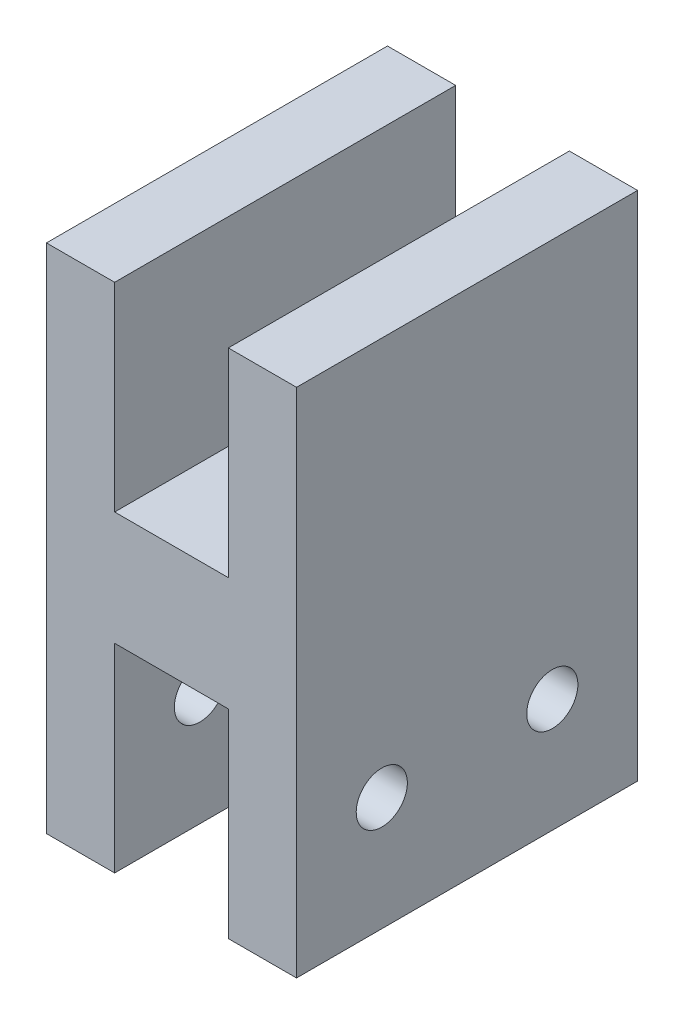
ISO-10303-21;
HEADER;
FILE_DESCRIPTION(('STEP AP214'),'2;1');
FILE_NAME('part.step','',(''),(''),'','','');
FILE_SCHEMA(('AUTOMOTIVE_DESIGN { 1 0 10303 214 1 1 1 1 }'));
ENDSEC;
DATA;
#1=APPLICATION_CONTEXT('core data for automotive mechanical design processes');
#2=APPLICATION_PROTOCOL_DEFINITION('international standard','automotive_design',2000,#1);
#3=PRODUCT_CONTEXT('',#1,'mechanical');
#4=PRODUCT('Part','Part','',(#3));
#5=PRODUCT_RELATED_PRODUCT_CATEGORY('part','',(#4));
#6=PRODUCT_DEFINITION_FORMATION('','',#4);
#7=PRODUCT_DEFINITION_CONTEXT('part definition',#1,'design');
#8=PRODUCT_DEFINITION('design','',#6,#7);
#9=PRODUCT_DEFINITION_SHAPE('','',#8);
#10=(LENGTH_UNIT() NAMED_UNIT(*) SI_UNIT(.MILLI.,.METRE.));
#11=(NAMED_UNIT(*) PLANE_ANGLE_UNIT() SI_UNIT($,.RADIAN.));
#12=(NAMED_UNIT(*) SI_UNIT($,.STERADIAN.) SOLID_ANGLE_UNIT());
#13=UNCERTAINTY_MEASURE_WITH_UNIT(LENGTH_MEASURE(1.E-05),#10,'distance_accuracy_value','');
#14=(GEOMETRIC_REPRESENTATION_CONTEXT(3) GLOBAL_UNCERTAINTY_ASSIGNED_CONTEXT((#13)) GLOBAL_UNIT_ASSIGNED_CONTEXT((#10,
#11,#12)) REPRESENTATION_CONTEXT('',''));
#15=CARTESIAN_POINT('',(0.,0.,0.));
#16=DIRECTION('',(0.,0.,1.));
#17=DIRECTION('',(1.,0.,0.));
#18=AXIS2_PLACEMENT_3D('',#15,#16,#17);
#19=CARTESIAN_POINT('',(-5.,17.5,30.));
#20=DIRECTION('',(0.,-1.,0.));
#21=DIRECTION('',(0.,0.,-1.));
#22=AXIS2_PLACEMENT_3D('',#19,#20,#21);
#23=PLANE('',#22);
#24=DIRECTION('',(-1.,0.,0.));
#25=VECTOR('',#24,1.);
#26=CARTESIAN_POINT('',(-5.,17.5,0.));
#27=LINE('',#26,#25);
#28=CARTESIAN_POINT('',(-5.,17.5,0.));
#29=VERTEX_POINT('',#28);
#30=CARTESIAN_POINT('',(-11.,17.5,0.));
#31=VERTEX_POINT('',#30);
#32=EDGE_CURVE('E159',#29,#31,#27,.T.);
#33=ORIENTED_EDGE('',*,*,#32,.T.);
#34=DIRECTION('',(0.,0.,-1.));
#35=VECTOR('',#34,1.);
#36=CARTESIAN_POINT('',(-11.,17.5,30.));
#37=LINE('',#36,#35);
#38=CARTESIAN_POINT('',(-11.,17.5,30.));
#39=VERTEX_POINT('',#38);
#40=EDGE_CURVE('E11',#39,#31,#37,.T.);
#41=ORIENTED_EDGE('',*,*,#40,.F.);
#42=DIRECTION('',(-1.,0.,0.));
#43=VECTOR('',#42,1.);
#44=CARTESIAN_POINT('',(-5.,17.5,30.));
#45=LINE('',#44,#43);
#46=CARTESIAN_POINT('',(-5.,17.5,30.));
#47=VERTEX_POINT('',#46);
#48=EDGE_CURVE('E182',#47,#39,#45,.T.);
#49=ORIENTED_EDGE('',*,*,#48,.F.);
#50=DIRECTION('',(0.,0.,-1.));
#51=VECTOR('',#50,1.);
#52=CARTESIAN_POINT('',(-5.,17.5,30.));
#53=LINE('',#52,#51);
#54=EDGE_CURVE('E155',#47,#29,#53,.T.);
#55=ORIENTED_EDGE('',*,*,#54,.T.);
#56=EDGE_LOOP('',(#33,#41,#49,#55));
#57=FACE_BOUND('',#56,.T.);
#58=ADVANCED_FACE('F37',(#57),#23,.F.);
#59=CARTESIAN_POINT('',(-11.,-27.5,30.));
#60=DIRECTION('',(1.,0.,0.));
#61=DIRECTION('',(0.,1.,0.));
#62=AXIS2_PLACEMENT_3D('',#59,#60,#61);
#63=PLANE('',#62);
#64=CARTESIAN_POINT('',(-11.,-17.5,7.5));
#65=DIRECTION('',(-1.,0.,0.));
#66=DIRECTION('',(0.,0.,1.));
#67=AXIS2_PLACEMENT_3D('',#64,#65,#66);
#68=CIRCLE('',#67,2.25);
#69=CARTESIAN_POINT('',(-11.,-17.5,9.75));
#70=VERTEX_POINT('',#69);
#71=EDGE_CURVE('E456',#70,#70,#68,.T.);
#72=ORIENTED_EDGE('',*,*,#71,.F.);
#73=EDGE_LOOP('',(#72));
#74=FACE_BOUND('',#73,.T.);
#75=CARTESIAN_POINT('',(-11.,-17.5,22.5));
#76=DIRECTION('',(-1.,0.,0.));
#77=DIRECTION('',(0.,0.,1.));
#78=AXIS2_PLACEMENT_3D('',#75,#76,#77);
#79=CIRCLE('',#78,2.25);
#80=CARTESIAN_POINT('',(-11.,-17.5,24.75));
#81=VERTEX_POINT('',#80);
#82=EDGE_CURVE('E208',#81,#81,#79,.T.);
#83=ORIENTED_EDGE('',*,*,#82,.F.);
#84=EDGE_LOOP('',(#83));
#85=FACE_BOUND('',#84,.T.);
#86=DIRECTION('',(0.,-1.,0.));
#87=VECTOR('',#86,1.);
#88=CARTESIAN_POINT('',(-11.,-27.5,0.));
#89=LINE('',#88,#87);
#90=CARTESIAN_POINT('',(-11.,-27.5,0.));
#91=VERTEX_POINT('',#90);
#92=EDGE_CURVE('E162',#31,#91,#89,.T.);
#93=ORIENTED_EDGE('',*,*,#92,.T.);
#94=DIRECTION('',(0.,0.,-1.));
#95=VECTOR('',#94,1.);
#96=CARTESIAN_POINT('',(-11.,-27.5,30.));
#97=LINE('',#96,#95);
#98=CARTESIAN_POINT('',(-11.,-27.5,30.));
#99=VERTEX_POINT('',#98);
#100=EDGE_CURVE('E46',#99,#91,#97,.T.);
#101=ORIENTED_EDGE('',*,*,#100,.F.);
#102=DIRECTION('',(0.,-1.,0.));
#103=VECTOR('',#102,1.);
#104=CARTESIAN_POINT('',(-11.,-27.5,30.));
#105=LINE('',#104,#103);
#106=EDGE_CURVE('E110',#39,#99,#105,.T.);
#107=ORIENTED_EDGE('',*,*,#106,.F.);
#108=ORIENTED_EDGE('',*,*,#40,.T.);
#109=EDGE_LOOP('',(#93,#101,#107,#108));
#110=FACE_BOUND('',#109,.T.);
#111=ADVANCED_FACE('F266',(#74,#85,#110),#63,.F.);
#112=CARTESIAN_POINT('',(-5.,-27.5,30.));
#113=DIRECTION('',(0.,1.,0.));
#114=DIRECTION('',(-1.,0.,0.));
#115=AXIS2_PLACEMENT_3D('',#112,#113,#114);
#116=PLANE('',#115);
#117=DIRECTION('',(1.,0.,0.));
#118=VECTOR('',#117,1.);
#119=CARTESIAN_POINT('',(-5.,-27.5,0.));
#120=LINE('',#119,#118);
#121=CARTESIAN_POINT('',(-5.,-27.5,0.));
#122=VERTEX_POINT('',#121);
#123=EDGE_CURVE('E165',#91,#122,#120,.T.);
#124=ORIENTED_EDGE('',*,*,#123,.T.);
#125=DIRECTION('',(0.,0.,-1.));
#126=VECTOR('',#125,1.);
#127=CARTESIAN_POINT('',(-5.,-27.5,30.));
#128=LINE('',#127,#126);
#129=CARTESIAN_POINT('',(-5.,-27.5,30.));
#130=VERTEX_POINT('',#129);
#131=EDGE_CURVE('E201',#130,#122,#128,.T.);
#132=ORIENTED_EDGE('',*,*,#131,.F.);
#133=DIRECTION('',(1.,0.,0.));
#134=VECTOR('',#133,1.);
#135=CARTESIAN_POINT('',(-5.,-27.5,30.));
#136=LINE('',#135,#134);
#137=EDGE_CURVE('E227',#99,#130,#136,.T.);
#138=ORIENTED_EDGE('',*,*,#137,.F.);
#139=ORIENTED_EDGE('',*,*,#100,.T.);
#140=EDGE_LOOP('',(#124,#132,#138,#139));
#141=FACE_BOUND('',#140,.T.);
#142=ADVANCED_FACE('F270',(#141),#116,.F.);
#143=CARTESIAN_POINT('',(-5.,-10.,30.));
#144=DIRECTION('',(-1.,0.,0.));
#145=DIRECTION('',(0.,0.,1.));
#146=AXIS2_PLACEMENT_3D('',#143,#144,#145);
#147=PLANE('',#146);
#148=CARTESIAN_POINT('',(-5.,-17.5,7.5));
#149=DIRECTION('',(-1.,0.,0.));
#150=DIRECTION('',(0.,0.,1.));
#151=AXIS2_PLACEMENT_3D('',#148,#149,#150);
#152=CIRCLE('',#151,2.25);
#153=CARTESIAN_POINT('',(-5.,-17.5,9.75));
#154=VERTEX_POINT('',#153);
#155=EDGE_CURVE('E214',#154,#154,#152,.T.);
#156=ORIENTED_EDGE('',*,*,#155,.T.);
#157=EDGE_LOOP('',(#156));
#158=FACE_BOUND('',#157,.T.);
#159=CARTESIAN_POINT('',(-5.,-17.5,22.5));
#160=DIRECTION('',(-1.,0.,0.));
#161=DIRECTION('',(0.,0.,1.));
#162=AXIS2_PLACEMENT_3D('',#159,#160,#161);
#163=CIRCLE('',#162,2.25);
#164=CARTESIAN_POINT('',(-5.,-17.5,24.75));
#165=VERTEX_POINT('',#164);
#166=EDGE_CURVE('E163',#165,#165,#163,.T.);
#167=ORIENTED_EDGE('',*,*,#166,.T.);
#168=EDGE_LOOP('',(#167));
#169=FACE_BOUND('',#168,.T.);
#170=DIRECTION('',(0.,1.,0.));
#171=VECTOR('',#170,1.);
#172=CARTESIAN_POINT('',(-5.,-10.,0.));
#173=LINE('',#172,#171);
#174=CARTESIAN_POINT('',(-5.,-10.,0.));
#175=VERTEX_POINT('',#174);
#176=EDGE_CURVE('E167',#122,#175,#173,.T.);
#177=ORIENTED_EDGE('',*,*,#176,.T.);
#178=DIRECTION('',(0.,0.,-1.));
#179=VECTOR('',#178,1.);
#180=CARTESIAN_POINT('',(-5.,-10.,30.));
#181=LINE('',#180,#179);
#182=CARTESIAN_POINT('',(-5.,-10.,30.));
#183=VERTEX_POINT('',#182);
#184=EDGE_CURVE('E198',#183,#175,#181,.T.);
#185=ORIENTED_EDGE('',*,*,#184,.F.);
#186=DIRECTION('',(0.,1.,0.));
#187=VECTOR('',#186,1.);
#188=CARTESIAN_POINT('',(-5.,-10.,30.));
#189=LINE('',#188,#187);
#190=EDGE_CURVE('E229',#130,#183,#189,.T.);
#191=ORIENTED_EDGE('',*,*,#190,.F.);
#192=ORIENTED_EDGE('',*,*,#131,.T.);
#193=EDGE_LOOP('',(#177,#185,#191,#192));
#194=FACE_BOUND('',#193,.T.);
#195=ADVANCED_FACE('F275',(#158,#169,#194),#147,.F.);
#196=CARTESIAN_POINT('',(5.,-10.,30.));
#197=DIRECTION('',(0.,1.,0.));
#198=DIRECTION('',(0.,0.,1.));
#199=AXIS2_PLACEMENT_3D('',#196,#197,#198);
#200=PLANE('',#199);
#201=DIRECTION('',(1.,0.,0.));
#202=VECTOR('',#201,1.);
#203=CARTESIAN_POINT('',(5.,-10.,0.));
#204=LINE('',#203,#202);
#205=CARTESIAN_POINT('',(5.,-10.,0.));
#206=VERTEX_POINT('',#205);
#207=EDGE_CURVE('E169',#175,#206,#204,.T.);
#208=ORIENTED_EDGE('',*,*,#207,.T.);
#209=DIRECTION('',(0.,0.,-1.));
#210=VECTOR('',#209,1.);
#211=CARTESIAN_POINT('',(5.,-10.,30.));
#212=LINE('',#211,#210);
#213=CARTESIAN_POINT('',(5.,-10.,30.));
#214=VERTEX_POINT('',#213);
#215=EDGE_CURVE('E195',#214,#206,#212,.T.);
#216=ORIENTED_EDGE('',*,*,#215,.F.);
#217=DIRECTION('',(1.,0.,0.));
#218=VECTOR('',#217,1.);
#219=CARTESIAN_POINT('',(5.,-10.,30.));
#220=LINE('',#219,#218);
#221=EDGE_CURVE('E231',#183,#214,#220,.T.);
#222=ORIENTED_EDGE('',*,*,#221,.F.);
#223=ORIENTED_EDGE('',*,*,#184,.T.);
#224=EDGE_LOOP('',(#208,#216,#222,#223));
#225=FACE_BOUND('',#224,.T.);
#226=ADVANCED_FACE('F283',(#225),#200,.F.);
#227=CARTESIAN_POINT('',(5.,-27.5,30.));
#228=DIRECTION('',(1.,0.,0.));
#229=DIRECTION('',(0.,0.,-1.));
#230=AXIS2_PLACEMENT_3D('',#227,#228,#229);
#231=PLANE('',#230);
#232=CARTESIAN_POINT('',(5.,-17.5,7.5));
#233=DIRECTION('',(1.,0.,0.));
#234=DIRECTION('',(0.,0.,-1.));
#235=AXIS2_PLACEMENT_3D('',#232,#233,#234);
#236=CIRCLE('',#235,2.25);
#237=CARTESIAN_POINT('',(5.,-17.5,5.25));
#238=VERTEX_POINT('',#237);
#239=EDGE_CURVE('E219',#238,#238,#236,.T.);
#240=ORIENTED_EDGE('',*,*,#239,.T.);
#241=EDGE_LOOP('',(#240));
#242=FACE_BOUND('',#241,.T.);
#243=CARTESIAN_POINT('',(5.,-17.5,22.5));
#244=DIRECTION('',(1.,0.,0.));
#245=DIRECTION('',(0.,0.,-1.));
#246=AXIS2_PLACEMENT_3D('',#243,#244,#245);
#247=CIRCLE('',#246,2.25);
#248=CARTESIAN_POINT('',(5.,-17.5,20.25));
#249=VERTEX_POINT('',#248);
#250=EDGE_CURVE('E207',#249,#249,#247,.T.);
#251=ORIENTED_EDGE('',*,*,#250,.T.);
#252=EDGE_LOOP('',(#251));
#253=FACE_BOUND('',#252,.T.);
#254=DIRECTION('',(0.,-1.,0.));
#255=VECTOR('',#254,1.);
#256=CARTESIAN_POINT('',(5.,-27.5,0.));
#257=LINE('',#256,#255);
#258=CARTESIAN_POINT('',(5.,-27.5,0.));
#259=VERTEX_POINT('',#258);
#260=EDGE_CURVE('E171',#206,#259,#257,.T.);
#261=ORIENTED_EDGE('',*,*,#260,.T.);
#262=DIRECTION('',(0.,0.,-1.));
#263=VECTOR('',#262,1.);
#264=CARTESIAN_POINT('',(5.,-27.5,30.));
#265=LINE('',#264,#263);
#266=CARTESIAN_POINT('',(5.,-27.5,30.));
#267=VERTEX_POINT('',#266);
#268=EDGE_CURVE('E192',#267,#259,#265,.T.);
#269=ORIENTED_EDGE('',*,*,#268,.F.);
#270=DIRECTION('',(0.,-1.,0.));
#271=VECTOR('',#270,1.);
#272=CARTESIAN_POINT('',(5.,-27.5,30.));
#273=LINE('',#272,#271);
#274=EDGE_CURVE('E233',#214,#267,#273,.T.);
#275=ORIENTED_EDGE('',*,*,#274,.F.);
#276=ORIENTED_EDGE('',*,*,#215,.T.);
#277=EDGE_LOOP('',(#261,#269,#275,#276));
#278=FACE_BOUND('',#277,.T.);
#279=ADVANCED_FACE('F287',(#242,#253,#278),#231,.F.);
#280=CARTESIAN_POINT('',(11.,-27.5,30.));
#281=DIRECTION('',(0.,1.,0.));
#282=DIRECTION('',(-1.,0.,0.));
#283=AXIS2_PLACEMENT_3D('',#280,#281,#282);
#284=PLANE('',#283);
#285=DIRECTION('',(1.,0.,0.));
#286=VECTOR('',#285,1.);
#287=CARTESIAN_POINT('',(11.,-27.5,0.));
#288=LINE('',#287,#286);
#289=CARTESIAN_POINT('',(11.,-27.5,0.));
#290=VERTEX_POINT('',#289);
#291=EDGE_CURVE('E173',#259,#290,#288,.T.);
#292=ORIENTED_EDGE('',*,*,#291,.T.);
#293=DIRECTION('',(0.,0.,-1.));
#294=VECTOR('',#293,1.);
#295=CARTESIAN_POINT('',(11.,-27.5,30.));
#296=LINE('',#295,#294);
#297=CARTESIAN_POINT('',(11.,-27.5,30.));
#298=VERTEX_POINT('',#297);
#299=EDGE_CURVE('E189',#298,#290,#296,.T.);
#300=ORIENTED_EDGE('',*,*,#299,.F.);
#301=DIRECTION('',(1.,0.,0.));
#302=VECTOR('',#301,1.);
#303=CARTESIAN_POINT('',(11.,-27.5,30.));
#304=LINE('',#303,#302);
#305=EDGE_CURVE('E235',#267,#298,#304,.T.);
#306=ORIENTED_EDGE('',*,*,#305,.F.);
#307=ORIENTED_EDGE('',*,*,#268,.T.);
#308=EDGE_LOOP('',(#292,#300,#306,#307));
#309=FACE_BOUND('',#308,.T.);
#310=ADVANCED_FACE('F291',(#309),#284,.F.);
#311=CARTESIAN_POINT('',(11.,-27.5,30.));
#312=DIRECTION('',(-1.,0.,0.));
#313=DIRECTION('',(0.,-1.,0.));
#314=AXIS2_PLACEMENT_3D('',#311,#312,#313);
#315=PLANE('',#314);
#316=CARTESIAN_POINT('',(11.,-17.5,7.5));
#317=DIRECTION('',(-1.,0.,0.));
#318=DIRECTION('',(0.,-1.,0.));
#319=AXIS2_PLACEMENT_3D('',#316,#317,#318);
#320=CIRCLE('',#319,2.25);
#321=CARTESIAN_POINT('',(11.,-19.75,7.5));
#322=VERTEX_POINT('',#321);
#323=EDGE_CURVE('E40',#322,#322,#320,.T.);
#324=ORIENTED_EDGE('',*,*,#323,.T.);
#325=EDGE_LOOP('',(#324));
#326=FACE_BOUND('',#325,.T.);
#327=CARTESIAN_POINT('',(11.,-17.5,22.5));
#328=DIRECTION('',(-1.,0.,0.));
#329=DIRECTION('',(0.,-1.,0.));
#330=AXIS2_PLACEMENT_3D('',#327,#328,#329);
#331=CIRCLE('',#330,2.25);
#332=CARTESIAN_POINT('',(11.,-19.75,22.5));
#333=VERTEX_POINT('',#332);
#334=EDGE_CURVE('E205',#333,#333,#331,.T.);
#335=ORIENTED_EDGE('',*,*,#334,.T.);
#336=EDGE_LOOP('',(#335));
#337=FACE_BOUND('',#336,.T.);
#338=DIRECTION('',(0.,1.,0.));
#339=VECTOR('',#338,1.);
#340=CARTESIAN_POINT('',(11.,-27.5,0.));
#341=LINE('',#340,#339);
#342=CARTESIAN_POINT('',(11.,17.5,0.));
#343=VERTEX_POINT('',#342);
#344=EDGE_CURVE('E175',#290,#343,#341,.T.);
#345=ORIENTED_EDGE('',*,*,#344,.T.);
#346=DIRECTION('',(0.,0.,-1.));
#347=VECTOR('',#346,1.);
#348=CARTESIAN_POINT('',(11.,17.5,30.));
#349=LINE('',#348,#347);
#350=CARTESIAN_POINT('',(11.,17.5,30.));
#351=VERTEX_POINT('',#350);
#352=EDGE_CURVE('E186',#351,#343,#349,.T.);
#353=ORIENTED_EDGE('',*,*,#352,.F.);
#354=DIRECTION('',(0.,1.,0.));
#355=VECTOR('',#354,1.);
#356=CARTESIAN_POINT('',(11.,-27.5,30.));
#357=LINE('',#356,#355);
#358=EDGE_CURVE('E237',#298,#351,#357,.T.);
#359=ORIENTED_EDGE('',*,*,#358,.F.);
#360=ORIENTED_EDGE('',*,*,#299,.T.);
#361=EDGE_LOOP('',(#345,#353,#359,#360));
#362=FACE_BOUND('',#361,.T.);
#363=ADVANCED_FACE('F243',(#326,#337,#362),#315,.F.);
#364=CARTESIAN_POINT('',(11.,17.5,30.));
#365=DIRECTION('',(0.,-1.,0.));
#366=DIRECTION('',(0.,0.,-1.));
#367=AXIS2_PLACEMENT_3D('',#364,#365,#366);
#368=PLANE('',#367);
#369=DIRECTION('',(-1.,0.,0.));
#370=VECTOR('',#369,1.);
#371=CARTESIAN_POINT('',(11.,17.5,0.));
#372=LINE('',#371,#370);
#373=CARTESIAN_POINT('',(5.,17.5,0.));
#374=VERTEX_POINT('',#373);
#375=EDGE_CURVE('E177',#343,#374,#372,.T.);
#376=ORIENTED_EDGE('',*,*,#375,.T.);
#377=DIRECTION('',(0.,0.,-1.));
#378=VECTOR('',#377,1.);
#379=CARTESIAN_POINT('',(5.,17.5,30.));
#380=LINE('',#379,#378);
#381=CARTESIAN_POINT('',(5.,17.5,30.));
#382=VERTEX_POINT('',#381);
#383=EDGE_CURVE('E150',#382,#374,#380,.T.);
#384=ORIENTED_EDGE('',*,*,#383,.F.);
#385=DIRECTION('',(-1.,0.,0.));
#386=VECTOR('',#385,1.);
#387=CARTESIAN_POINT('',(11.,17.5,30.));
#388=LINE('',#387,#386);
#389=EDGE_CURVE('E141',#351,#382,#388,.T.);
#390=ORIENTED_EDGE('',*,*,#389,.F.);
#391=ORIENTED_EDGE('',*,*,#352,.T.);
#392=EDGE_LOOP('',(#376,#384,#390,#391));
#393=FACE_BOUND('',#392,.T.);
#394=ADVANCED_FACE('F247',(#393),#368,.F.);
#395=CARTESIAN_POINT('',(5.,17.5,30.));
#396=DIRECTION('',(1.,0.,0.));
#397=DIRECTION('',(0.,1.,0.));
#398=AXIS2_PLACEMENT_3D('',#395,#396,#397);
#399=PLANE('',#398);
#400=DIRECTION('',(0.,-1.,0.));
#401=VECTOR('',#400,1.);
#402=CARTESIAN_POINT('',(5.,17.5,0.));
#403=LINE('',#402,#401);
#404=CARTESIAN_POINT('',(5.,0.,0.));
#405=VERTEX_POINT('',#404);
#406=EDGE_CURVE('E149',#374,#405,#403,.T.);
#407=ORIENTED_EDGE('',*,*,#406,.T.);
#408=DIRECTION('',(0.,0.,-1.));
#409=VECTOR('',#408,1.);
#410=CARTESIAN_POINT('',(5.,0.,30.));
#411=LINE('',#410,#409);
#412=CARTESIAN_POINT('',(5.,0.,30.));
#413=VERTEX_POINT('',#412);
#414=EDGE_CURVE('E146',#413,#405,#411,.T.);
#415=ORIENTED_EDGE('',*,*,#414,.F.);
#416=DIRECTION('',(0.,-1.,0.));
#417=VECTOR('',#416,1.);
#418=CARTESIAN_POINT('',(5.,17.5,30.));
#419=LINE('',#418,#417);
#420=EDGE_CURVE('E135',#382,#413,#419,.T.);
#421=ORIENTED_EDGE('',*,*,#420,.F.);
#422=ORIENTED_EDGE('',*,*,#383,.T.);
#423=EDGE_LOOP('',(#407,#415,#421,#422));
#424=FACE_BOUND('',#423,.T.);
#425=ADVANCED_FACE('F147',(#424),#399,.F.);
#426=CARTESIAN_POINT('',(5.,0.,30.));
#427=DIRECTION('',(0.,-1.,0.));
#428=DIRECTION('',(0.,0.,-1.));
#429=AXIS2_PLACEMENT_3D('',#426,#427,#428);
#430=PLANE('',#429);
#431=DIRECTION('',(-1.,0.,0.));
#432=VECTOR('',#431,1.);
#433=CARTESIAN_POINT('',(5.,0.,0.));
#434=LINE('',#433,#432);
#435=CARTESIAN_POINT('',(-5.,0.,0.));
#436=VERTEX_POINT('',#435);
#437=EDGE_CURVE('E96',#405,#436,#434,.T.);
#438=ORIENTED_EDGE('',*,*,#437,.T.);
#439=DIRECTION('',(0.,0.,-1.));
#440=VECTOR('',#439,1.);
#441=CARTESIAN_POINT('',(-5.,0.,30.));
#442=LINE('',#441,#440);
#443=CARTESIAN_POINT('',(-5.,0.,30.));
#444=VERTEX_POINT('',#443);
#445=EDGE_CURVE('E151',#444,#436,#442,.T.);
#446=ORIENTED_EDGE('',*,*,#445,.F.);
#447=DIRECTION('',(-1.,0.,0.));
#448=VECTOR('',#447,1.);
#449=CARTESIAN_POINT('',(5.,0.,30.));
#450=LINE('',#449,#448);
#451=EDGE_CURVE('E139',#413,#444,#450,.T.);
#452=ORIENTED_EDGE('',*,*,#451,.F.);
#453=ORIENTED_EDGE('',*,*,#414,.T.);
#454=EDGE_LOOP('',(#438,#446,#452,#453));
#455=FACE_BOUND('',#454,.T.);
#456=ADVANCED_FACE('F153',(#455),#430,.F.);
#457=CARTESIAN_POINT('',(-5.,0.,30.));
#458=DIRECTION('',(-1.,0.,0.));
#459=DIRECTION('',(0.,-1.,0.));
#460=AXIS2_PLACEMENT_3D('',#457,#458,#459);
#461=PLANE('',#460);
#462=DIRECTION('',(0.,1.,0.));
#463=VECTOR('',#462,1.);
#464=CARTESIAN_POINT('',(-5.,0.,0.));
#465=LINE('',#464,#463);
#466=EDGE_CURVE('E102',#436,#29,#465,.T.);
#467=ORIENTED_EDGE('',*,*,#466,.T.);
#468=ORIENTED_EDGE('',*,*,#54,.F.);
#469=DIRECTION('',(0.,1.,0.));
#470=VECTOR('',#469,1.);
#471=CARTESIAN_POINT('',(-5.,0.,30.));
#472=LINE('',#471,#470);
#473=EDGE_CURVE('E55',#444,#47,#472,.T.);
#474=ORIENTED_EDGE('',*,*,#473,.F.);
#475=ORIENTED_EDGE('',*,*,#445,.T.);
#476=EDGE_LOOP('',(#467,#468,#474,#475));
#477=FACE_BOUND('',#476,.T.);
#478=ADVANCED_FACE('F255',(#477),#461,.F.);
#479=CARTESIAN_POINT('',(0.,0.,30.));
#480=DIRECTION('',(0.,0.,-1.));
#481=DIRECTION('',(-1.,0.,0.));
#482=AXIS2_PLACEMENT_3D('',#479,#480,#481);
#483=PLANE('',#482);
#484=ORIENTED_EDGE('',*,*,#48,.T.);
#485=ORIENTED_EDGE('',*,*,#106,.T.);
#486=ORIENTED_EDGE('',*,*,#137,.T.);
#487=ORIENTED_EDGE('',*,*,#190,.T.);
#488=ORIENTED_EDGE('',*,*,#221,.T.);
#489=ORIENTED_EDGE('',*,*,#274,.T.);
#490=ORIENTED_EDGE('',*,*,#305,.T.);
#491=ORIENTED_EDGE('',*,*,#358,.T.);
#492=ORIENTED_EDGE('',*,*,#389,.T.);
#493=ORIENTED_EDGE('',*,*,#420,.T.);
#494=ORIENTED_EDGE('',*,*,#451,.T.);
#495=ORIENTED_EDGE('',*,*,#473,.T.);
#496=EDGE_LOOP('',(#484,#485,#486,#487,#488,#489,#490,#491,#492,#493,#494,#495));
#497=FACE_BOUND('',#496,.T.);
#498=ADVANCED_FACE('F137',(#497),#483,.F.);
#499=CARTESIAN_POINT('',(0.,0.,0.));
#500=DIRECTION('',(0.,0.,-1.));
#501=DIRECTION('',(-1.,0.,0.));
#502=AXIS2_PLACEMENT_3D('',#499,#500,#501);
#503=PLANE('',#502);
#504=ORIENTED_EDGE('',*,*,#32,.F.);
#505=ORIENTED_EDGE('',*,*,#466,.F.);
#506=ORIENTED_EDGE('',*,*,#437,.F.);
#507=ORIENTED_EDGE('',*,*,#406,.F.);
#508=ORIENTED_EDGE('',*,*,#375,.F.);
#509=ORIENTED_EDGE('',*,*,#344,.F.);
#510=ORIENTED_EDGE('',*,*,#291,.F.);
#511=ORIENTED_EDGE('',*,*,#260,.F.);
#512=ORIENTED_EDGE('',*,*,#207,.F.);
#513=ORIENTED_EDGE('',*,*,#176,.F.);
#514=ORIENTED_EDGE('',*,*,#123,.F.);
#515=ORIENTED_EDGE('',*,*,#92,.F.);
#516=EDGE_LOOP('',(#504,#505,#506,#507,#508,#509,#510,#511,#512,#513,#514,#515));
#517=FACE_BOUND('',#516,.T.);
#518=ADVANCED_FACE('F250',(#517),#503,.T.);
#519=CARTESIAN_POINT('',(-11.,-17.5,22.5));
#520=DIRECTION('',(-1.,0.,0.));
#521=DIRECTION('',(0.,0.,1.));
#522=AXIS2_PLACEMENT_3D('',#519,#520,#521);
#523=CYLINDRICAL_SURFACE('',#522,2.25);
#524=ORIENTED_EDGE('',*,*,#334,.F.);
#525=EDGE_LOOP('',(#524));
#526=FACE_BOUND('',#525,.T.);
#527=ORIENTED_EDGE('',*,*,#250,.F.);
#528=EDGE_LOOP('',(#527));
#529=FACE_BOUND('',#528,.T.);
#530=ADVANCED_FACE('F331',(#526,#529),#523,.F.);
#531=ORIENTED_EDGE('',*,*,#82,.T.);
#532=EDGE_LOOP('',(#531));
#533=FACE_BOUND('',#532,.T.);
#534=ORIENTED_EDGE('',*,*,#166,.F.);
#535=EDGE_LOOP('',(#534));
#536=FACE_BOUND('',#535,.T.);
#537=ADVANCED_FACE('F372',(#533,#536),#523,.F.);
#538=CARTESIAN_POINT('',(-11.,-17.5,7.5));
#539=DIRECTION('',(-1.,0.,0.));
#540=DIRECTION('',(0.,0.,1.));
#541=AXIS2_PLACEMENT_3D('',#538,#539,#540);
#542=CYLINDRICAL_SURFACE('',#541,2.25);
#543=ORIENTED_EDGE('',*,*,#323,.F.);
#544=EDGE_LOOP('',(#543));
#545=FACE_BOUND('',#544,.T.);
#546=ORIENTED_EDGE('',*,*,#239,.F.);
#547=EDGE_LOOP('',(#546));
#548=FACE_BOUND('',#547,.T.);
#549=ADVANCED_FACE('F383',(#545,#548),#542,.F.);
#550=ORIENTED_EDGE('',*,*,#71,.T.);
#551=EDGE_LOOP('',(#550));
#552=FACE_BOUND('',#551,.T.);
#553=ORIENTED_EDGE('',*,*,#155,.F.);
#554=EDGE_LOOP('',(#553));
#555=FACE_BOUND('',#554,.T.);
#556=ADVANCED_FACE('F392',(#552,#555),#542,.F.);
#557=CLOSED_SHELL('',(#58,#111,#142,#195,#226,#279,#310,#363,#394,#425,#456,#478,#498,#518,#530,
#537,#549,#556));
#558=MANIFOLD_SOLID_BREP('B2',#557);
#559=ADVANCED_BREP_SHAPE_REPRESENTATION('',(#18,#558),#14);
#560=SHAPE_DEFINITION_REPRESENTATION(#9,#559);
ENDSEC;
END-ISO-10303-21;
